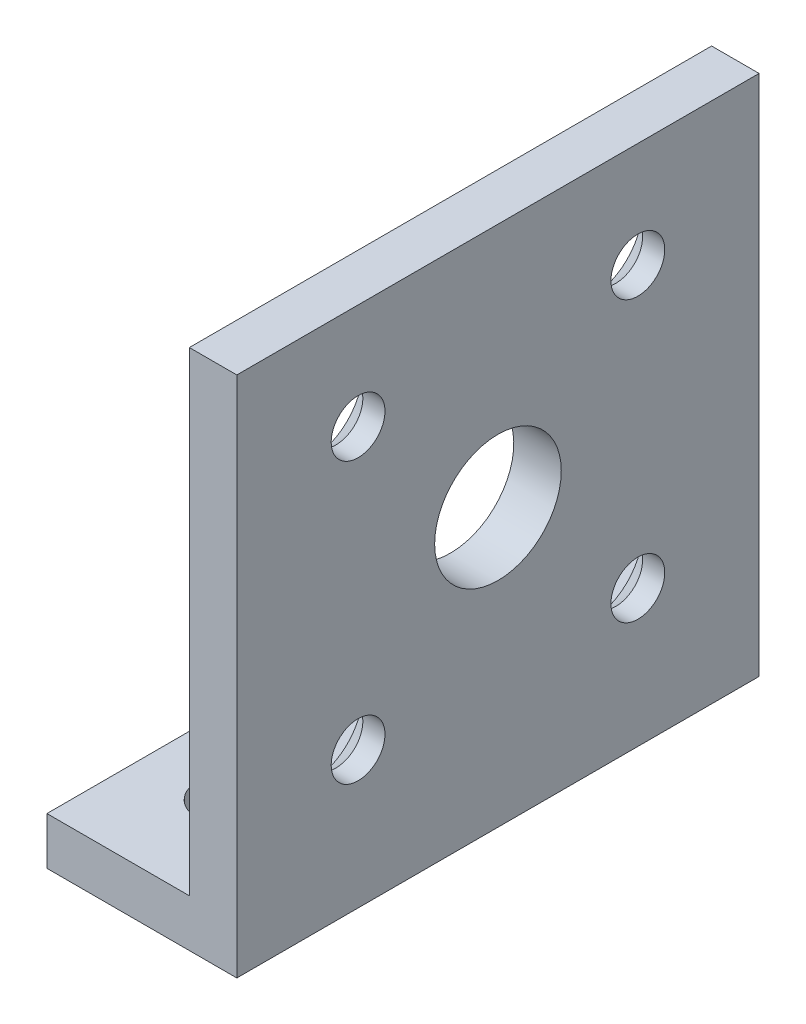
ISO-10303-21;
HEADER;
FILE_DESCRIPTION(('STEP AP214'),'2;1');
FILE_NAME('part.step','',(''),(''),'','','');
FILE_SCHEMA(('AUTOMOTIVE_DESIGN { 1 0 10303 214 1 1 1 1 }'));
ENDSEC;
DATA;
#1=APPLICATION_CONTEXT('core data for automotive mechanical design processes');
#2=APPLICATION_PROTOCOL_DEFINITION('international standard','automotive_design',2000,#1);
#3=PRODUCT_CONTEXT('',#1,'mechanical');
#4=PRODUCT('Part','Part','',(#3));
#5=PRODUCT_RELATED_PRODUCT_CATEGORY('part','',(#4));
#6=PRODUCT_DEFINITION_FORMATION('','',#4);
#7=PRODUCT_DEFINITION_CONTEXT('part definition',#1,'design');
#8=PRODUCT_DEFINITION('design','',#6,#7);
#9=PRODUCT_DEFINITION_SHAPE('','',#8);
#10=(LENGTH_UNIT() NAMED_UNIT(*) SI_UNIT(.MILLI.,.METRE.));
#11=(NAMED_UNIT(*) PLANE_ANGLE_UNIT() SI_UNIT($,.RADIAN.));
#12=(NAMED_UNIT(*) SI_UNIT($,.STERADIAN.) SOLID_ANGLE_UNIT());
#13=UNCERTAINTY_MEASURE_WITH_UNIT(LENGTH_MEASURE(1.E-05),#10,'distance_accuracy_value','');
#14=(GEOMETRIC_REPRESENTATION_CONTEXT(3) GLOBAL_UNCERTAINTY_ASSIGNED_CONTEXT((#13)) GLOBAL_UNIT_ASSIGNED_CONTEXT((#10,
#11,#12)) REPRESENTATION_CONTEXT('',''));
#15=CARTESIAN_POINT('',(0.,0.,0.));
#16=DIRECTION('',(0.,0.,1.));
#17=DIRECTION('',(1.,0.,0.));
#18=AXIS2_PLACEMENT_3D('',#15,#16,#17);
#19=CARTESIAN_POINT('',(0.,3.,16.5));
#20=DIRECTION('',(0.,-1.,0.));
#21=DIRECTION('',(1.,0.,0.));
#22=AXIS2_PLACEMENT_3D('',#19,#20,#21);
#23=PLANE('',#22);
#24=CARTESIAN_POINT('',(-7.00000000000001,3.,-10.));
#25=DIRECTION('',(0.,1.,0.));
#26=DIRECTION('',(0.,0.,1.));
#27=AXIS2_PLACEMENT_3D('',#24,#25,#26);
#28=CIRCLE('',#27,1.99999999999999);
#29=CARTESIAN_POINT('',(-7.00000000000001,3.,-8.00000000000002));
#30=VERTEX_POINT('',#29);
#31=EDGE_CURVE('E220',#30,#30,#28,.T.);
#32=ORIENTED_EDGE('',*,*,#31,.F.);
#33=EDGE_LOOP('',(#32));
#34=FACE_BOUND('',#33,.T.);
#35=CARTESIAN_POINT('',(-7.,3.,10.));
#36=DIRECTION('',(0.,1.,0.));
#37=DIRECTION('',(0.,0.,1.));
#38=AXIS2_PLACEMENT_3D('',#35,#36,#37);
#39=CIRCLE('',#38,1.99999999999999);
#40=CARTESIAN_POINT('',(-7.,3.,12.));
#41=VERTEX_POINT('',#40);
#42=EDGE_CURVE('E223',#41,#41,#39,.T.);
#43=ORIENTED_EDGE('',*,*,#42,.F.);
#44=EDGE_LOOP('',(#43));
#45=FACE_BOUND('',#44,.T.);
#46=DIRECTION('',(-1.,0.,0.));
#47=VECTOR('',#46,1.);
#48=CARTESIAN_POINT('',(0.,3.,-16.5));
#49=LINE('',#48,#47);
#50=CARTESIAN_POINT('',(-3.,3.,-16.5));
#51=VERTEX_POINT('',#50);
#52=CARTESIAN_POINT('',(-12.,3.,-16.5));
#53=VERTEX_POINT('',#52);
#54=EDGE_CURVE('E123',#51,#53,#49,.T.);
#55=ORIENTED_EDGE('',*,*,#54,.T.);
#56=DIRECTION('',(0.,0.,-1.));
#57=VECTOR('',#56,1.);
#58=CARTESIAN_POINT('',(-12.,3.,16.5));
#59=LINE('',#58,#57);
#60=CARTESIAN_POINT('',(-12.,3.,16.5));
#61=VERTEX_POINT('',#60);
#62=EDGE_CURVE('E11',#61,#53,#59,.T.);
#63=ORIENTED_EDGE('',*,*,#62,.F.);
#64=DIRECTION('',(-1.,0.,0.));
#65=VECTOR('',#64,1.);
#66=CARTESIAN_POINT('',(0.,3.,16.5));
#67=LINE('',#66,#65);
#68=CARTESIAN_POINT('',(-3.,3.,16.5));
#69=VERTEX_POINT('',#68);
#70=EDGE_CURVE('E87',#69,#61,#67,.T.);
#71=ORIENTED_EDGE('',*,*,#70,.F.);
#72=DIRECTION('',(0.,0.,-1.));
#73=VECTOR('',#72,1.);
#74=CARTESIAN_POINT('',(-3.,3.,16.5));
#75=LINE('',#74,#73);
#76=EDGE_CURVE('E119',#69,#51,#75,.T.);
#77=ORIENTED_EDGE('',*,*,#76,.T.);
#78=EDGE_LOOP('',(#55,#63,#71,#77));
#79=FACE_BOUND('',#78,.T.);
#80=ADVANCED_FACE('F38',(#34,#45,#79),#23,.F.);
#81=CARTESIAN_POINT('',(-12.,0.,16.5));
#82=DIRECTION('',(-1.,0.,0.));
#83=DIRECTION('',(0.,0.,1.));
#84=AXIS2_PLACEMENT_3D('',#81,#82,#83);
#85=PLANE('',#84);
#86=DIRECTION('',(0.,1.,0.));
#87=VECTOR('',#86,1.);
#88=CARTESIAN_POINT('',(-12.,0.,-16.5));
#89=LINE('',#88,#87);
#90=CARTESIAN_POINT('',(-12.,0.,-16.5));
#91=VERTEX_POINT('',#90);
#92=EDGE_CURVE('E126',#91,#53,#89,.T.);
#93=ORIENTED_EDGE('',*,*,#92,.F.);
#94=DIRECTION('',(0.,0.,-1.));
#95=VECTOR('',#94,1.);
#96=CARTESIAN_POINT('',(-12.,0.,16.5));
#97=LINE('',#96,#95);
#98=CARTESIAN_POINT('',(-12.,0.,16.5));
#99=VERTEX_POINT('',#98);
#100=EDGE_CURVE('E48',#99,#91,#97,.T.);
#101=ORIENTED_EDGE('',*,*,#100,.F.);
#102=DIRECTION('',(0.,1.,0.));
#103=VECTOR('',#102,1.);
#104=CARTESIAN_POINT('',(-12.,0.,16.5));
#105=LINE('',#104,#103);
#106=EDGE_CURVE('E187',#99,#61,#105,.T.);
#107=ORIENTED_EDGE('',*,*,#106,.T.);
#108=ORIENTED_EDGE('',*,*,#62,.T.);
#109=EDGE_LOOP('',(#93,#101,#107,#108));
#110=FACE_BOUND('',#109,.T.);
#111=ADVANCED_FACE('F211',(#110),#85,.T.);
#112=CARTESIAN_POINT('',(0.,0.,16.5));
#113=DIRECTION('',(0.,-1.,0.));
#114=DIRECTION('',(1.,0.,0.));
#115=AXIS2_PLACEMENT_3D('',#112,#113,#114);
#116=PLANE('',#115);
#117=CARTESIAN_POINT('',(-7.00000000000001,0.,-10.));
#118=DIRECTION('',(0.,-1.,0.));
#119=DIRECTION('',(1.,0.,0.));
#120=AXIS2_PLACEMENT_3D('',#117,#118,#119);
#121=CIRCLE('',#120,1.99999999999999);
#122=CARTESIAN_POINT('',(-5.00000000000001,0.,-10.));
#123=VERTEX_POINT('',#122);
#124=EDGE_CURVE('E226',#123,#123,#121,.T.);
#125=ORIENTED_EDGE('',*,*,#124,.F.);
#126=EDGE_LOOP('',(#125));
#127=FACE_BOUND('',#126,.T.);
#128=CARTESIAN_POINT('',(-7.,0.,9.99999999999999));
#129=DIRECTION('',(0.,-1.,0.));
#130=DIRECTION('',(1.,0.,0.));
#131=AXIS2_PLACEMENT_3D('',#128,#129,#130);
#132=CIRCLE('',#131,1.99999999999999);
#133=CARTESIAN_POINT('',(-5.00000000000001,0.,9.99999999999999));
#134=VERTEX_POINT('',#133);
#135=EDGE_CURVE('E225',#134,#134,#132,.T.);
#136=ORIENTED_EDGE('',*,*,#135,.F.);
#137=EDGE_LOOP('',(#136));
#138=FACE_BOUND('',#137,.T.);
#139=DIRECTION('',(-1.,0.,0.));
#140=VECTOR('',#139,1.);
#141=CARTESIAN_POINT('',(0.,0.,-16.5));
#142=LINE('',#141,#140);
#143=CARTESIAN_POINT('',(0.,0.,-16.5));
#144=VERTEX_POINT('',#143);
#145=EDGE_CURVE('E130',#144,#91,#142,.T.);
#146=ORIENTED_EDGE('',*,*,#145,.F.);
#147=DIRECTION('',(0.,0.,-1.));
#148=VECTOR('',#147,1.);
#149=CARTESIAN_POINT('',(0.,0.,16.5));
#150=LINE('',#149,#148);
#151=CARTESIAN_POINT('',(0.,0.,16.5));
#152=VERTEX_POINT('',#151);
#153=EDGE_CURVE('E109',#152,#144,#150,.T.);
#154=ORIENTED_EDGE('',*,*,#153,.F.);
#155=DIRECTION('',(-1.,0.,0.));
#156=VECTOR('',#155,1.);
#157=CARTESIAN_POINT('',(0.,0.,16.5));
#158=LINE('',#157,#156);
#159=EDGE_CURVE('E115',#152,#99,#158,.T.);
#160=ORIENTED_EDGE('',*,*,#159,.T.);
#161=ORIENTED_EDGE('',*,*,#100,.T.);
#162=EDGE_LOOP('',(#146,#154,#160,#161));
#163=FACE_BOUND('',#162,.T.);
#164=ADVANCED_FACE('F191',(#127,#138,#163),#116,.T.);
#165=CARTESIAN_POINT('',(0.,33.,16.5));
#166=DIRECTION('',(1.,0.,0.));
#167=DIRECTION('',(0.,1.,0.));
#168=AXIS2_PLACEMENT_3D('',#165,#166,#167);
#169=PLANE('',#168);
#170=CARTESIAN_POINT('',(0.,8.66116523516814,8.83883476483182));
#171=DIRECTION('',(1.,0.,0.));
#172=DIRECTION('',(0.,1.,0.));
#173=AXIS2_PLACEMENT_3D('',#170,#171,#172);
#174=CIRCLE('',#173,1.7);
#175=CARTESIAN_POINT('',(0.,10.3611652351681,8.83883476483182));
#176=VERTEX_POINT('',#175);
#177=EDGE_CURVE('E41',#176,#176,#174,.T.);
#178=ORIENTED_EDGE('',*,*,#177,.F.);
#179=EDGE_LOOP('',(#178));
#180=FACE_BOUND('',#179,.T.);
#181=CARTESIAN_POINT('',(0.,8.66116523516817,-8.83883476483186));
#182=DIRECTION('',(1.,0.,0.));
#183=DIRECTION('',(0.,1.,0.));
#184=AXIS2_PLACEMENT_3D('',#181,#182,#183);
#185=CIRCLE('',#184,1.7);
#186=CARTESIAN_POINT('',(0.,10.3611652351682,-8.83883476483186));
#187=VERTEX_POINT('',#186);
#188=EDGE_CURVE('E155',#187,#187,#185,.T.);
#189=ORIENTED_EDGE('',*,*,#188,.F.);
#190=EDGE_LOOP('',(#189));
#191=FACE_BOUND('',#190,.T.);
#192=CARTESIAN_POINT('',(0.,26.3388347648318,-8.83883476483183));
#193=DIRECTION('',(1.,0.,0.));
#194=DIRECTION('',(0.,1.,0.));
#195=AXIS2_PLACEMENT_3D('',#192,#193,#194);
#196=CIRCLE('',#195,1.7);
#197=CARTESIAN_POINT('',(0.,28.0388347648318,-8.83883476483183));
#198=VERTEX_POINT('',#197);
#199=EDGE_CURVE('E150',#198,#198,#196,.T.);
#200=ORIENTED_EDGE('',*,*,#199,.F.);
#201=EDGE_LOOP('',(#200));
#202=FACE_BOUND('',#201,.T.);
#203=CARTESIAN_POINT('',(0.,26.3388347648318,8.83883476483186));
#204=DIRECTION('',(1.,0.,0.));
#205=DIRECTION('',(0.,1.,0.));
#206=AXIS2_PLACEMENT_3D('',#203,#204,#205);
#207=CIRCLE('',#206,1.7);
#208=CARTESIAN_POINT('',(0.,28.0388347648318,8.83883476483186));
#209=VERTEX_POINT('',#208);
#210=EDGE_CURVE('E145',#209,#209,#207,.T.);
#211=ORIENTED_EDGE('',*,*,#210,.F.);
#212=EDGE_LOOP('',(#211));
#213=FACE_BOUND('',#212,.T.);
#214=CARTESIAN_POINT('',(0.,17.5,0.));
#215=DIRECTION('',(1.,0.,0.));
#216=DIRECTION('',(0.,1.,0.));
#217=AXIS2_PLACEMENT_3D('',#214,#215,#216);
#218=CIRCLE('',#217,4.);
#219=CARTESIAN_POINT('',(0.,21.5,0.));
#220=VERTEX_POINT('',#219);
#221=EDGE_CURVE('E148',#220,#220,#218,.F.);
#222=ORIENTED_EDGE('',*,*,#221,.T.);
#223=EDGE_LOOP('',(#222));
#224=FACE_BOUND('',#223,.T.);
#225=DIRECTION('',(0.,-1.,0.));
#226=VECTOR('',#225,1.);
#227=CARTESIAN_POINT('',(0.,33.,-16.5));
#228=LINE('',#227,#226);
#229=CARTESIAN_POINT('',(0.,33.,-16.5));
#230=VERTEX_POINT('',#229);
#231=EDGE_CURVE('E103',#230,#144,#228,.T.);
#232=ORIENTED_EDGE('',*,*,#231,.F.);
#233=DIRECTION('',(0.,0.,-1.));
#234=VECTOR('',#233,1.);
#235=CARTESIAN_POINT('',(0.,33.,16.5));
#236=LINE('',#235,#234);
#237=CARTESIAN_POINT('',(0.,33.,16.5));
#238=VERTEX_POINT('',#237);
#239=EDGE_CURVE('E98',#238,#230,#236,.T.);
#240=ORIENTED_EDGE('',*,*,#239,.F.);
#241=DIRECTION('',(0.,-1.,0.));
#242=VECTOR('',#241,1.);
#243=CARTESIAN_POINT('',(0.,33.,16.5));
#244=LINE('',#243,#242);
#245=EDGE_CURVE('E101',#238,#152,#244,.T.);
#246=ORIENTED_EDGE('',*,*,#245,.T.);
#247=ORIENTED_EDGE('',*,*,#153,.T.);
#248=EDGE_LOOP('',(#232,#240,#246,#247));
#249=FACE_BOUND('',#248,.T.);
#250=ADVANCED_FACE('F100',(#180,#191,#202,#213,#224,#249),#169,.T.);
#251=CARTESIAN_POINT('',(-2.99999999999999,33.,16.5));
#252=DIRECTION('',(0.,1.,0.));
#253=DIRECTION('',(0.,0.,1.));
#254=AXIS2_PLACEMENT_3D('',#251,#252,#253);
#255=PLANE('',#254);
#256=DIRECTION('',(1.,0.,0.));
#257=VECTOR('',#256,1.);
#258=CARTESIAN_POINT('',(-3.,33.,-16.5));
#259=LINE('',#258,#257);
#260=CARTESIAN_POINT('',(-3.,33.,-16.5));
#261=VERTEX_POINT('',#260);
#262=EDGE_CURVE('E135',#261,#230,#259,.T.);
#263=ORIENTED_EDGE('',*,*,#262,.F.);
#264=DIRECTION('',(0.,0.,-1.));
#265=VECTOR('',#264,1.);
#266=CARTESIAN_POINT('',(-2.99999999999999,33.,16.5));
#267=LINE('',#266,#265);
#268=CARTESIAN_POINT('',(-2.99999999999999,33.,16.5));
#269=VERTEX_POINT('',#268);
#270=EDGE_CURVE('E78',#269,#261,#267,.T.);
#271=ORIENTED_EDGE('',*,*,#270,.F.);
#272=DIRECTION('',(1.,0.,0.));
#273=VECTOR('',#272,1.);
#274=CARTESIAN_POINT('',(-2.99999999999999,33.,16.5));
#275=LINE('',#274,#273);
#276=EDGE_CURVE('E113',#269,#238,#275,.T.);
#277=ORIENTED_EDGE('',*,*,#276,.T.);
#278=ORIENTED_EDGE('',*,*,#239,.T.);
#279=EDGE_LOOP('',(#263,#271,#277,#278));
#280=FACE_BOUND('',#279,.T.);
#281=ADVANCED_FACE('F117',(#280),#255,.T.);
#282=CARTESIAN_POINT('',(-2.99999999999999,33.,16.5));
#283=DIRECTION('',(1.,0.,0.));
#284=DIRECTION('',(0.,1.,0.));
#285=AXIS2_PLACEMENT_3D('',#282,#283,#284);
#286=PLANE('',#285);
#287=CARTESIAN_POINT('',(-3.,8.66116523516814,8.83883476483182));
#288=DIRECTION('',(-1.,0.,0.));
#289=DIRECTION('',(0.,0.,1.));
#290=AXIS2_PLACEMENT_3D('',#287,#288,#289);
#291=CIRCLE('',#290,3.3);
#292=CARTESIAN_POINT('',(-3.,8.66116523516814,12.1388347648318));
#293=VERTEX_POINT('',#292);
#294=EDGE_CURVE('E229',#293,#293,#291,.T.);
#295=ORIENTED_EDGE('',*,*,#294,.F.);
#296=EDGE_LOOP('',(#295));
#297=FACE_BOUND('',#296,.T.);
#298=CARTESIAN_POINT('',(-3.,8.66116523516817,-8.83883476483186));
#299=DIRECTION('',(-1.,0.,0.));
#300=DIRECTION('',(0.,0.,1.));
#301=AXIS2_PLACEMENT_3D('',#298,#299,#300);
#302=CIRCLE('',#301,3.3);
#303=CARTESIAN_POINT('',(-3.,8.66116523516817,-5.53883476483186));
#304=VERTEX_POINT('',#303);
#305=EDGE_CURVE('E165',#304,#304,#302,.T.);
#306=ORIENTED_EDGE('',*,*,#305,.F.);
#307=EDGE_LOOP('',(#306));
#308=FACE_BOUND('',#307,.T.);
#309=CARTESIAN_POINT('',(-3.,26.3388347648318,-8.83883476483183));
#310=DIRECTION('',(-1.,0.,0.));
#311=DIRECTION('',(0.,0.,1.));
#312=AXIS2_PLACEMENT_3D('',#309,#310,#311);
#313=CIRCLE('',#312,3.3);
#314=CARTESIAN_POINT('',(-3.,26.3388347648318,-5.53883476483183));
#315=VERTEX_POINT('',#314);
#316=EDGE_CURVE('E157',#315,#315,#313,.T.);
#317=ORIENTED_EDGE('',*,*,#316,.F.);
#318=EDGE_LOOP('',(#317));
#319=FACE_BOUND('',#318,.T.);
#320=CARTESIAN_POINT('',(-3.,26.3388347648318,8.83883476483186));
#321=DIRECTION('',(-1.,0.,0.));
#322=DIRECTION('',(0.,0.,1.));
#323=AXIS2_PLACEMENT_3D('',#320,#321,#322);
#324=CIRCLE('',#323,3.3);
#325=CARTESIAN_POINT('',(-3.,26.3388347648318,12.1388347648319));
#326=VERTEX_POINT('',#325);
#327=EDGE_CURVE('E153',#326,#326,#324,.T.);
#328=ORIENTED_EDGE('',*,*,#327,.F.);
#329=EDGE_LOOP('',(#328));
#330=FACE_BOUND('',#329,.T.);
#331=CARTESIAN_POINT('',(-3.,17.5,0.));
#332=DIRECTION('',(-1.,0.,0.));
#333=DIRECTION('',(0.,-1.,0.));
#334=AXIS2_PLACEMENT_3D('',#331,#332,#333);
#335=CIRCLE('',#334,4.);
#336=CARTESIAN_POINT('',(-3.,13.5,0.));
#337=VERTEX_POINT('',#336);
#338=EDGE_CURVE('E127',#337,#337,#335,.T.);
#339=ORIENTED_EDGE('',*,*,#338,.F.);
#340=EDGE_LOOP('',(#339));
#341=FACE_BOUND('',#340,.T.);
#342=DIRECTION('',(0.,-1.,0.));
#343=VECTOR('',#342,1.);
#344=CARTESIAN_POINT('',(-3.,33.,-16.5));
#345=LINE('',#344,#343);
#346=EDGE_CURVE('E81',#261,#51,#345,.T.);
#347=ORIENTED_EDGE('',*,*,#346,.T.);
#348=ORIENTED_EDGE('',*,*,#76,.F.);
#349=DIRECTION('',(0.,-1.,0.));
#350=VECTOR('',#349,1.);
#351=CARTESIAN_POINT('',(-2.99999999999999,33.,16.5));
#352=LINE('',#351,#350);
#353=EDGE_CURVE('E57',#269,#69,#352,.T.);
#354=ORIENTED_EDGE('',*,*,#353,.F.);
#355=ORIENTED_EDGE('',*,*,#270,.T.);
#356=EDGE_LOOP('',(#347,#348,#354,#355));
#357=FACE_BOUND('',#356,.T.);
#358=ADVANCED_FACE('F197',(#297,#308,#319,#330,#341,#357),#286,.F.);
#359=CARTESIAN_POINT('',(0.,0.,16.5));
#360=DIRECTION('',(0.,0.,-1.));
#361=DIRECTION('',(-1.,0.,0.));
#362=AXIS2_PLACEMENT_3D('',#359,#360,#361);
#363=PLANE('',#362);
#364=ORIENTED_EDGE('',*,*,#70,.T.);
#365=ORIENTED_EDGE('',*,*,#106,.F.);
#366=ORIENTED_EDGE('',*,*,#159,.F.);
#367=ORIENTED_EDGE('',*,*,#245,.F.);
#368=ORIENTED_EDGE('',*,*,#276,.F.);
#369=ORIENTED_EDGE('',*,*,#353,.T.);
#370=EDGE_LOOP('',(#364,#365,#366,#367,#368,#369));
#371=FACE_BOUND('',#370,.T.);
#372=ADVANCED_FACE('F112',(#371),#363,.F.);
#373=CARTESIAN_POINT('',(0.,0.,-16.5));
#374=DIRECTION('',(0.,0.,-1.));
#375=DIRECTION('',(-1.,0.,0.));
#376=AXIS2_PLACEMENT_3D('',#373,#374,#375);
#377=PLANE('',#376);
#378=ORIENTED_EDGE('',*,*,#54,.F.);
#379=ORIENTED_EDGE('',*,*,#346,.F.);
#380=ORIENTED_EDGE('',*,*,#262,.T.);
#381=ORIENTED_EDGE('',*,*,#231,.T.);
#382=ORIENTED_EDGE('',*,*,#145,.T.);
#383=ORIENTED_EDGE('',*,*,#92,.T.);
#384=EDGE_LOOP('',(#378,#379,#380,#381,#382,#383));
#385=FACE_BOUND('',#384,.T.);
#386=ADVANCED_FACE('F195',(#385),#377,.T.);
#387=CARTESIAN_POINT('',(0.001000000000001,17.5,0.));
#388=DIRECTION('',(-1.,0.,0.));
#389=DIRECTION('',(0.,-1.,0.));
#390=AXIS2_PLACEMENT_3D('',#387,#388,#389);
#391=CYLINDRICAL_SURFACE('',#390,4.);
#392=ORIENTED_EDGE('',*,*,#221,.F.);
#393=EDGE_LOOP('',(#392));
#394=FACE_BOUND('',#393,.T.);
#395=ORIENTED_EDGE('',*,*,#338,.T.);
#396=EDGE_LOOP('',(#395));
#397=FACE_BOUND('',#396,.T.);
#398=ADVANCED_FACE('F255',(#394,#397),#391,.F.);
#399=CARTESIAN_POINT('',(-3.,26.3388347648318,8.83883476483186));
#400=DIRECTION('',(-1.,0.,0.));
#401=DIRECTION('',(0.,0.,1.));
#402=AXIS2_PLACEMENT_3D('',#399,#400,#401);
#403=CYLINDRICAL_SURFACE('',#402,1.7);
#404=ORIENTED_EDGE('',*,*,#210,.T.);
#405=EDGE_LOOP('',(#404));
#406=FACE_BOUND('',#405,.T.);
#407=CARTESIAN_POINT('',(-1.4,26.3388347648318,8.83883476483186));
#408=DIRECTION('',(-1.,0.,0.));
#409=DIRECTION('',(0.,0.,1.));
#410=AXIS2_PLACEMENT_3D('',#407,#408,#409);
#411=CIRCLE('',#410,1.7);
#412=CARTESIAN_POINT('',(-1.4,26.3388347648318,10.5388347648319));
#413=VERTEX_POINT('',#412);
#414=EDGE_CURVE('E149',#413,#413,#411,.T.);
#415=ORIENTED_EDGE('',*,*,#414,.T.);
#416=EDGE_LOOP('',(#415));
#417=FACE_BOUND('',#416,.T.);
#418=ADVANCED_FACE('F258',(#406,#417),#403,.F.);
#419=CARTESIAN_POINT('',(-3.,26.3388347648318,8.83883476483186));
#420=DIRECTION('',(-1.,0.,0.));
#421=DIRECTION('',(0.,0.,1.));
#422=AXIS2_PLACEMENT_3D('',#419,#420,#421);
#423=CONICAL_SURFACE('',#422,3.3,0.785398163397449);
#424=ORIENTED_EDGE('',*,*,#414,.F.);
#425=EDGE_LOOP('',(#424));
#426=FACE_BOUND('',#425,.T.);
#427=ORIENTED_EDGE('',*,*,#327,.T.);
#428=EDGE_LOOP('',(#427));
#429=FACE_BOUND('',#428,.T.);
#430=ADVANCED_FACE('F266',(#426,#429),#423,.F.);
#431=CARTESIAN_POINT('',(-3.,26.3388347648318,-8.83883476483183));
#432=DIRECTION('',(-1.,0.,0.));
#433=DIRECTION('',(0.,0.,1.));
#434=AXIS2_PLACEMENT_3D('',#431,#432,#433);
#435=CYLINDRICAL_SURFACE('',#434,1.7);
#436=ORIENTED_EDGE('',*,*,#199,.T.);
#437=EDGE_LOOP('',(#436));
#438=FACE_BOUND('',#437,.T.);
#439=CARTESIAN_POINT('',(-1.4,26.3388347648318,-8.83883476483183));
#440=DIRECTION('',(-1.,0.,0.));
#441=DIRECTION('',(0.,0.,1.));
#442=AXIS2_PLACEMENT_3D('',#439,#440,#441);
#443=CIRCLE('',#442,1.7);
#444=CARTESIAN_POINT('',(-1.4,26.3388347648318,-7.13883476483183));
#445=VERTEX_POINT('',#444);
#446=EDGE_CURVE('E154',#445,#445,#443,.T.);
#447=ORIENTED_EDGE('',*,*,#446,.T.);
#448=EDGE_LOOP('',(#447));
#449=FACE_BOUND('',#448,.T.);
#450=ADVANCED_FACE('F272',(#438,#449),#435,.F.);
#451=CARTESIAN_POINT('',(-3.,26.3388347648318,-8.83883476483183));
#452=DIRECTION('',(-1.,0.,0.));
#453=DIRECTION('',(0.,0.,1.));
#454=AXIS2_PLACEMENT_3D('',#451,#452,#453);
#455=CONICAL_SURFACE('',#454,3.3,0.785398163397448);
#456=ORIENTED_EDGE('',*,*,#446,.F.);
#457=EDGE_LOOP('',(#456));
#458=FACE_BOUND('',#457,.T.);
#459=ORIENTED_EDGE('',*,*,#316,.T.);
#460=EDGE_LOOP('',(#459));
#461=FACE_BOUND('',#460,.T.);
#462=ADVANCED_FACE('F276',(#458,#461),#455,.F.);
#463=CARTESIAN_POINT('',(-3.,8.66116523516817,-8.83883476483186));
#464=DIRECTION('',(-1.,0.,0.));
#465=DIRECTION('',(0.,0.,1.));
#466=AXIS2_PLACEMENT_3D('',#463,#464,#465);
#467=CYLINDRICAL_SURFACE('',#466,1.7);
#468=ORIENTED_EDGE('',*,*,#188,.T.);
#469=EDGE_LOOP('',(#468));
#470=FACE_BOUND('',#469,.T.);
#471=CARTESIAN_POINT('',(-1.4,8.66116523516817,-8.83883476483186));
#472=DIRECTION('',(-1.,0.,0.));
#473=DIRECTION('',(0.,0.,1.));
#474=AXIS2_PLACEMENT_3D('',#471,#472,#473);
#475=CIRCLE('',#474,1.7);
#476=CARTESIAN_POINT('',(-1.4,8.66116523516817,-7.13883476483186));
#477=VERTEX_POINT('',#476);
#478=EDGE_CURVE('E158',#477,#477,#475,.T.);
#479=ORIENTED_EDGE('',*,*,#478,.T.);
#480=EDGE_LOOP('',(#479));
#481=FACE_BOUND('',#480,.T.);
#482=ADVANCED_FACE('F280',(#470,#481),#467,.F.);
#483=CARTESIAN_POINT('',(-3.,8.66116523516817,-8.83883476483186));
#484=DIRECTION('',(-1.,0.,0.));
#485=DIRECTION('',(0.,0.,1.));
#486=AXIS2_PLACEMENT_3D('',#483,#484,#485);
#487=CONICAL_SURFACE('',#486,3.3,0.785398163397448);
#488=ORIENTED_EDGE('',*,*,#478,.F.);
#489=EDGE_LOOP('',(#488));
#490=FACE_BOUND('',#489,.T.);
#491=ORIENTED_EDGE('',*,*,#305,.T.);
#492=EDGE_LOOP('',(#491));
#493=FACE_BOUND('',#492,.T.);
#494=ADVANCED_FACE('F284',(#490,#493),#487,.F.);
#495=CARTESIAN_POINT('',(-3.,8.66116523516814,8.83883476483182));
#496=DIRECTION('',(-1.,0.,0.));
#497=DIRECTION('',(0.,0.,1.));
#498=AXIS2_PLACEMENT_3D('',#495,#496,#497);
#499=CYLINDRICAL_SURFACE('',#498,1.7);
#500=ORIENTED_EDGE('',*,*,#177,.T.);
#501=EDGE_LOOP('',(#500));
#502=FACE_BOUND('',#501,.T.);
#503=CARTESIAN_POINT('',(-1.4,8.66116523516814,8.83883476483182));
#504=DIRECTION('',(-1.,0.,0.));
#505=DIRECTION('',(0.,0.,1.));
#506=AXIS2_PLACEMENT_3D('',#503,#504,#505);
#507=CIRCLE('',#506,1.7);
#508=CARTESIAN_POINT('',(-1.4,8.66116523516814,10.5388347648318));
#509=VERTEX_POINT('',#508);
#510=EDGE_CURVE('E236',#509,#509,#507,.T.);
#511=ORIENTED_EDGE('',*,*,#510,.T.);
#512=EDGE_LOOP('',(#511));
#513=FACE_BOUND('',#512,.T.);
#514=ADVANCED_FACE('F243',(#502,#513),#499,.F.);
#515=CARTESIAN_POINT('',(-3.,8.66116523516814,8.83883476483182));
#516=DIRECTION('',(-1.,0.,0.));
#517=DIRECTION('',(0.,0.,1.));
#518=AXIS2_PLACEMENT_3D('',#515,#516,#517);
#519=CONICAL_SURFACE('',#518,3.3,0.785398163397448);
#520=ORIENTED_EDGE('',*,*,#510,.F.);
#521=EDGE_LOOP('',(#520));
#522=FACE_BOUND('',#521,.T.);
#523=ORIENTED_EDGE('',*,*,#294,.T.);
#524=EDGE_LOOP('',(#523));
#525=FACE_BOUND('',#524,.T.);
#526=ADVANCED_FACE('F290',(#522,#525),#519,.F.);
#527=CARTESIAN_POINT('',(-7.,3.,10.));
#528=DIRECTION('',(0.,1.,0.));
#529=DIRECTION('',(0.,0.,1.));
#530=AXIS2_PLACEMENT_3D('',#527,#528,#529);
#531=CYLINDRICAL_SURFACE('',#530,1.99999999999999);
#532=ORIENTED_EDGE('',*,*,#42,.T.);
#533=EDGE_LOOP('',(#532));
#534=FACE_BOUND('',#533,.T.);
#535=ORIENTED_EDGE('',*,*,#135,.T.);
#536=EDGE_LOOP('',(#535));
#537=FACE_BOUND('',#536,.T.);
#538=ADVANCED_FACE('F293',(#534,#537),#531,.F.);
#539=CARTESIAN_POINT('',(-7.00000000000001,3.,-10.));
#540=DIRECTION('',(0.,1.,0.));
#541=DIRECTION('',(0.,0.,1.));
#542=AXIS2_PLACEMENT_3D('',#539,#540,#541);
#543=CYLINDRICAL_SURFACE('',#542,1.99999999999999);
#544=ORIENTED_EDGE('',*,*,#31,.T.);
#545=EDGE_LOOP('',(#544));
#546=FACE_BOUND('',#545,.T.);
#547=ORIENTED_EDGE('',*,*,#124,.T.);
#548=EDGE_LOOP('',(#547));
#549=FACE_BOUND('',#548,.T.);
#550=ADVANCED_FACE('F297',(#546,#549),#543,.F.);
#551=CLOSED_SHELL('',(#80,#111,#164,#250,#281,#358,#372,#386,#398,#418,#430,#450,#462,#482,#494,
#514,#526,#538,#550));
#552=MANIFOLD_SOLID_BREP('B2',#551);
#553=ADVANCED_BREP_SHAPE_REPRESENTATION('',(#18,#552),#14);
#554=SHAPE_DEFINITION_REPRESENTATION(#9,#553);
ENDSEC;
END-ISO-10303-21;
